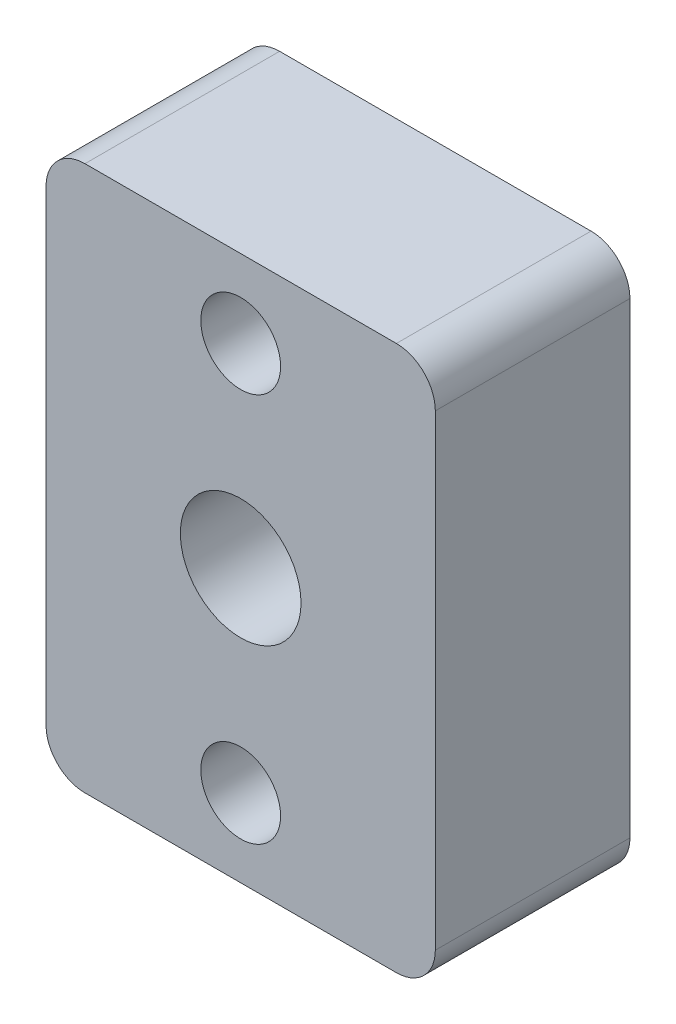
ISO-10303-21;
HEADER;
FILE_DESCRIPTION(('STEP AP214'),'2;1');
FILE_NAME('part.step','',(''),(''),'','','');
FILE_SCHEMA(('AUTOMOTIVE_DESIGN { 1 0 10303 214 1 1 1 1 }'));
ENDSEC;
DATA;
#1=APPLICATION_CONTEXT('core data for automotive mechanical design processes');
#2=APPLICATION_PROTOCOL_DEFINITION('international standard','automotive_design',2000,#1);
#3=PRODUCT_CONTEXT('',#1,'mechanical');
#4=PRODUCT('Part','Part','',(#3));
#5=PRODUCT_RELATED_PRODUCT_CATEGORY('part','',(#4));
#6=PRODUCT_DEFINITION_FORMATION('','',#4);
#7=PRODUCT_DEFINITION_CONTEXT('part definition',#1,'design');
#8=PRODUCT_DEFINITION('design','',#6,#7);
#9=PRODUCT_DEFINITION_SHAPE('','',#8);
#10=(LENGTH_UNIT() NAMED_UNIT(*) SI_UNIT(.MILLI.,.METRE.));
#11=(NAMED_UNIT(*) PLANE_ANGLE_UNIT() SI_UNIT($,.RADIAN.));
#12=(NAMED_UNIT(*) SI_UNIT($,.STERADIAN.) SOLID_ANGLE_UNIT());
#13=UNCERTAINTY_MEASURE_WITH_UNIT(LENGTH_MEASURE(1.E-05),#10,'distance_accuracy_value','');
#14=(GEOMETRIC_REPRESENTATION_CONTEXT(3) GLOBAL_UNCERTAINTY_ASSIGNED_CONTEXT((#13)) GLOBAL_UNIT_ASSIGNED_CONTEXT((#10,
#11,#12)) REPRESENTATION_CONTEXT('',''));
#15=CARTESIAN_POINT('',(0.,0.,0.));
#16=DIRECTION('',(0.,0.,1.));
#17=DIRECTION('',(1.,0.,0.));
#18=AXIS2_PLACEMENT_3D('',#15,#16,#17);
#19=CARTESIAN_POINT('',(0.,0.,5.));
#20=DIRECTION('',(0.,0.,-1.));
#21=DIRECTION('',(-1.,0.,0.));
#22=AXIS2_PLACEMENT_3D('',#19,#20,#21);
#23=PLANE('',#22);
#24=DIRECTION('',(1.,0.,0.));
#25=VECTOR('',#24,1.);
#26=CARTESIAN_POINT('',(-10.,-14.,5.));
#27=LINE('',#26,#25);
#28=CARTESIAN_POINT('',(-8.,-14.,5.));
#29=VERTEX_POINT('',#28);
#30=CARTESIAN_POINT('',(8.00000000000001,-14.,5.));
#31=VERTEX_POINT('',#30);
#32=EDGE_CURVE('E140',#29,#31,#27,.T.);
#33=ORIENTED_EDGE('',*,*,#32,.T.);
#34=CARTESIAN_POINT('',(8.,-12.,5.));
#35=DIRECTION('',(0.,0.,-1.));
#36=DIRECTION('',(-1.,0.,0.));
#37=AXIS2_PLACEMENT_3D('',#34,#35,#36);
#38=CIRCLE('',#37,2.);
#39=CARTESIAN_POINT('',(10.,-12.,5.));
#40=VERTEX_POINT('',#39);
#41=EDGE_CURVE('E159',#31,#40,#38,.F.);
#42=ORIENTED_EDGE('',*,*,#41,.T.);
#43=DIRECTION('',(0.,1.,0.));
#44=VECTOR('',#43,1.);
#45=CARTESIAN_POINT('',(10.,-14.,5.));
#46=LINE('',#45,#44);
#47=CARTESIAN_POINT('',(10.,12.,5.));
#48=VERTEX_POINT('',#47);
#49=EDGE_CURVE('E123',#40,#48,#46,.T.);
#50=ORIENTED_EDGE('',*,*,#49,.T.);
#51=CARTESIAN_POINT('',(8.00000000000001,12.,5.));
#52=DIRECTION('',(0.,0.,-1.));
#53=DIRECTION('',(-1.,0.,0.));
#54=AXIS2_PLACEMENT_3D('',#51,#52,#53);
#55=CIRCLE('',#54,2.);
#56=CARTESIAN_POINT('',(8.00000000000001,14.,5.));
#57=VERTEX_POINT('',#56);
#58=EDGE_CURVE('E154',#48,#57,#55,.F.);
#59=ORIENTED_EDGE('',*,*,#58,.T.);
#60=DIRECTION('',(-1.,0.,0.));
#61=VECTOR('',#60,1.);
#62=CARTESIAN_POINT('',(-10.,14.,5.));
#63=LINE('',#62,#61);
#64=CARTESIAN_POINT('',(-8.,14.,5.));
#65=VERTEX_POINT('',#64);
#66=EDGE_CURVE('E170',#57,#65,#63,.T.);
#67=ORIENTED_EDGE('',*,*,#66,.T.);
#68=CARTESIAN_POINT('',(-8.,12.,5.));
#69=DIRECTION('',(0.,0.,-1.));
#70=DIRECTION('',(-1.,0.,0.));
#71=AXIS2_PLACEMENT_3D('',#68,#69,#70);
#72=CIRCLE('',#71,2.);
#73=CARTESIAN_POINT('',(-10.,12.,5.));
#74=VERTEX_POINT('',#73);
#75=EDGE_CURVE('E59',#65,#74,#72,.F.);
#76=ORIENTED_EDGE('',*,*,#75,.T.);
#77=DIRECTION('',(0.,-1.,0.));
#78=VECTOR('',#77,1.);
#79=CARTESIAN_POINT('',(-10.,-14.,5.));
#80=LINE('',#79,#78);
#81=CARTESIAN_POINT('',(-10.,-12.,5.));
#82=VERTEX_POINT('',#81);
#83=EDGE_CURVE('E178',#74,#82,#80,.T.);
#84=ORIENTED_EDGE('',*,*,#83,.T.);
#85=CARTESIAN_POINT('',(-8.,-12.,5.));
#86=DIRECTION('',(0.,0.,-1.));
#87=DIRECTION('',(-1.,0.,0.));
#88=AXIS2_PLACEMENT_3D('',#85,#86,#87);
#89=CIRCLE('',#88,2.);
#90=EDGE_CURVE('E157',#82,#29,#89,.F.);
#91=ORIENTED_EDGE('',*,*,#90,.T.);
#92=EDGE_LOOP('',(#33,#42,#50,#59,#67,#76,#84,#91));
#93=FACE_BOUND('',#92,.T.);
#94=CARTESIAN_POINT('',(0.,10.,5.));
#95=DIRECTION('',(0.,0.,1.));
#96=DIRECTION('',(1.,0.,0.));
#97=AXIS2_PLACEMENT_3D('',#94,#95,#96);
#98=CIRCLE('',#97,2.05);
#99=CARTESIAN_POINT('',(2.05,10.,5.));
#100=VERTEX_POINT('',#99);
#101=EDGE_CURVE('E131',#100,#100,#98,.T.);
#102=ORIENTED_EDGE('',*,*,#101,.F.);
#103=EDGE_LOOP('',(#102));
#104=FACE_BOUND('',#103,.T.);
#105=CARTESIAN_POINT('',(0.,-10.,5.));
#106=DIRECTION('',(0.,0.,1.));
#107=DIRECTION('',(1.,0.,0.));
#108=AXIS2_PLACEMENT_3D('',#105,#106,#107);
#109=CIRCLE('',#108,2.05);
#110=CARTESIAN_POINT('',(2.05,-10.,5.));
#111=VERTEX_POINT('',#110);
#112=EDGE_CURVE('E185',#111,#111,#109,.T.);
#113=ORIENTED_EDGE('',*,*,#112,.F.);
#114=EDGE_LOOP('',(#113));
#115=FACE_BOUND('',#114,.T.);
#116=CARTESIAN_POINT('',(0.,0.,5.));
#117=DIRECTION('',(0.,0.,1.));
#118=DIRECTION('',(1.,0.,0.));
#119=AXIS2_PLACEMENT_3D('',#116,#117,#118);
#120=CIRCLE('',#119,3.1);
#121=CARTESIAN_POINT('',(3.1,0.,5.));
#122=VERTEX_POINT('',#121);
#123=EDGE_CURVE('E190',#122,#122,#120,.T.);
#124=ORIENTED_EDGE('',*,*,#123,.F.);
#125=EDGE_LOOP('',(#124));
#126=FACE_BOUND('',#125,.T.);
#127=ADVANCED_FACE('F37',(#93,#104,#115,#126),#23,.F.);
#128=CARTESIAN_POINT('',(0.,0.,-5.));
#129=DIRECTION('',(0.,0.,-1.));
#130=DIRECTION('',(-1.,0.,0.));
#131=AXIS2_PLACEMENT_3D('',#128,#129,#130);
#132=PLANE('',#131);
#133=CARTESIAN_POINT('',(0.,-10.,-5.));
#134=DIRECTION('',(0.,0.,1.));
#135=DIRECTION('',(1.,0.,0.));
#136=AXIS2_PLACEMENT_3D('',#133,#134,#135);
#137=CIRCLE('',#136,2.05);
#138=CARTESIAN_POINT('',(2.05,-10.,-5.));
#139=VERTEX_POINT('',#138);
#140=EDGE_CURVE('E187',#139,#139,#137,.T.);
#141=ORIENTED_EDGE('',*,*,#140,.T.);
#142=EDGE_LOOP('',(#141));
#143=FACE_BOUND('',#142,.T.);
#144=DIRECTION('',(0.,1.,0.));
#145=VECTOR('',#144,1.);
#146=CARTESIAN_POINT('',(10.,-14.,-5.));
#147=LINE('',#146,#145);
#148=CARTESIAN_POINT('',(10.,-12.,-5.));
#149=VERTEX_POINT('',#148);
#150=CARTESIAN_POINT('',(10.,12.,-5.));
#151=VERTEX_POINT('',#150);
#152=EDGE_CURVE('E120',#149,#151,#147,.T.);
#153=ORIENTED_EDGE('',*,*,#152,.F.);
#154=CARTESIAN_POINT('',(8.,-12.,-5.));
#155=DIRECTION('',(0.,0.,-1.));
#156=DIRECTION('',(-1.,0.,0.));
#157=AXIS2_PLACEMENT_3D('',#154,#155,#156);
#158=CIRCLE('',#157,2.);
#159=CARTESIAN_POINT('',(8.00000000000001,-14.,-5.));
#160=VERTEX_POINT('',#159);
#161=EDGE_CURVE('E103',#149,#160,#158,.T.);
#162=ORIENTED_EDGE('',*,*,#161,.T.);
#163=DIRECTION('',(1.,0.,0.));
#164=VECTOR('',#163,1.);
#165=CARTESIAN_POINT('',(-10.,-14.,-5.));
#166=LINE('',#165,#164);
#167=CARTESIAN_POINT('',(-8.,-14.,-5.));
#168=VERTEX_POINT('',#167);
#169=EDGE_CURVE('E144',#168,#160,#166,.T.);
#170=ORIENTED_EDGE('',*,*,#169,.F.);
#171=CARTESIAN_POINT('',(-8.,-12.,-5.));
#172=DIRECTION('',(0.,0.,-1.));
#173=DIRECTION('',(-1.,0.,0.));
#174=AXIS2_PLACEMENT_3D('',#171,#172,#173);
#175=CIRCLE('',#174,2.);
#176=CARTESIAN_POINT('',(-10.,-12.,-5.));
#177=VERTEX_POINT('',#176);
#178=EDGE_CURVE('E114',#168,#177,#175,.T.);
#179=ORIENTED_EDGE('',*,*,#178,.T.);
#180=DIRECTION('',(0.,-1.,0.));
#181=VECTOR('',#180,1.);
#182=CARTESIAN_POINT('',(-10.,-14.,-5.));
#183=LINE('',#182,#181);
#184=CARTESIAN_POINT('',(-10.,12.,-5.));
#185=VERTEX_POINT('',#184);
#186=EDGE_CURVE('E134',#185,#177,#183,.T.);
#187=ORIENTED_EDGE('',*,*,#186,.F.);
#188=CARTESIAN_POINT('',(-8.,12.,-5.));
#189=DIRECTION('',(0.,0.,-1.));
#190=DIRECTION('',(-1.,0.,0.));
#191=AXIS2_PLACEMENT_3D('',#188,#189,#190);
#192=CIRCLE('',#191,2.);
#193=CARTESIAN_POINT('',(-8.,14.,-5.));
#194=VERTEX_POINT('',#193);
#195=EDGE_CURVE('E148',#185,#194,#192,.T.);
#196=ORIENTED_EDGE('',*,*,#195,.T.);
#197=DIRECTION('',(-1.,0.,0.));
#198=VECTOR('',#197,1.);
#199=CARTESIAN_POINT('',(-10.,14.,-5.));
#200=LINE('',#199,#198);
#201=CARTESIAN_POINT('',(8.00000000000001,14.,-5.));
#202=VERTEX_POINT('',#201);
#203=EDGE_CURVE('E130',#202,#194,#200,.T.);
#204=ORIENTED_EDGE('',*,*,#203,.F.);
#205=CARTESIAN_POINT('',(8.00000000000001,12.,-5.));
#206=DIRECTION('',(0.,0.,-1.));
#207=DIRECTION('',(-1.,0.,0.));
#208=AXIS2_PLACEMENT_3D('',#205,#206,#207);
#209=CIRCLE('',#208,2.);
#210=EDGE_CURVE('E124',#202,#151,#209,.T.);
#211=ORIENTED_EDGE('',*,*,#210,.T.);
#212=EDGE_LOOP('',(#153,#162,#170,#179,#187,#196,#204,#211));
#213=FACE_BOUND('',#212,.T.);
#214=CARTESIAN_POINT('',(0.,10.,-5.));
#215=DIRECTION('',(0.,0.,1.));
#216=DIRECTION('',(1.,0.,0.));
#217=AXIS2_PLACEMENT_3D('',#214,#215,#216);
#218=CIRCLE('',#217,2.05);
#219=CARTESIAN_POINT('',(2.05,10.,-5.));
#220=VERTEX_POINT('',#219);
#221=EDGE_CURVE('E137',#220,#220,#218,.T.);
#222=ORIENTED_EDGE('',*,*,#221,.T.);
#223=EDGE_LOOP('',(#222));
#224=FACE_BOUND('',#223,.T.);
#225=CARTESIAN_POINT('',(0.,0.,-5.));
#226=DIRECTION('',(0.,0.,1.));
#227=DIRECTION('',(1.,0.,0.));
#228=AXIS2_PLACEMENT_3D('',#225,#226,#227);
#229=CIRCLE('',#228,3.1);
#230=CARTESIAN_POINT('',(3.1,0.,-5.));
#231=VERTEX_POINT('',#230);
#232=EDGE_CURVE('E193',#231,#231,#229,.T.);
#233=ORIENTED_EDGE('',*,*,#232,.T.);
#234=EDGE_LOOP('',(#233));
#235=FACE_BOUND('',#234,.T.);
#236=ADVANCED_FACE('F127',(#143,#213,#224,#235),#132,.T.);
#237=CARTESIAN_POINT('',(10.,-14.,5.));
#238=DIRECTION('',(-1.,0.,0.));
#239=DIRECTION('',(0.,0.,1.));
#240=AXIS2_PLACEMENT_3D('',#237,#238,#239);
#241=PLANE('',#240);
#242=ORIENTED_EDGE('',*,*,#49,.F.);
#243=DIRECTION('',(0.,0.,-1.));
#244=VECTOR('',#243,1.);
#245=CARTESIAN_POINT('',(10.,-12.,5.));
#246=LINE('',#245,#244);
#247=EDGE_CURVE('E107',#40,#149,#246,.T.);
#248=ORIENTED_EDGE('',*,*,#247,.T.);
#249=ORIENTED_EDGE('',*,*,#152,.T.);
#250=DIRECTION('',(0.,0.,-1.));
#251=VECTOR('',#250,1.);
#252=CARTESIAN_POINT('',(10.,12.,5.));
#253=LINE('',#252,#251);
#254=EDGE_CURVE('E125',#151,#48,#253,.F.);
#255=ORIENTED_EDGE('',*,*,#254,.T.);
#256=EDGE_LOOP('',(#242,#248,#249,#255));
#257=FACE_BOUND('',#256,.T.);
#258=ADVANCED_FACE('F119',(#257),#241,.F.);
#259=CARTESIAN_POINT('',(-10.,14.,5.));
#260=DIRECTION('',(0.,-1.,0.));
#261=DIRECTION('',(0.,0.,-1.));
#262=AXIS2_PLACEMENT_3D('',#259,#260,#261);
#263=PLANE('',#262);
#264=ORIENTED_EDGE('',*,*,#203,.T.);
#265=DIRECTION('',(0.,0.,-1.));
#266=VECTOR('',#265,1.);
#267=CARTESIAN_POINT('',(-8.,14.,5.));
#268=LINE('',#267,#266);
#269=EDGE_CURVE('E11',#194,#65,#268,.F.);
#270=ORIENTED_EDGE('',*,*,#269,.T.);
#271=ORIENTED_EDGE('',*,*,#66,.F.);
#272=DIRECTION('',(0.,0.,-1.));
#273=VECTOR('',#272,1.);
#274=CARTESIAN_POINT('',(8.00000000000001,14.,5.));
#275=LINE('',#274,#273);
#276=EDGE_CURVE('E45',#57,#202,#275,.T.);
#277=ORIENTED_EDGE('',*,*,#276,.T.);
#278=EDGE_LOOP('',(#264,#270,#271,#277));
#279=FACE_BOUND('',#278,.T.);
#280=ADVANCED_FACE('F168',(#279),#263,.F.);
#281=CARTESIAN_POINT('',(-10.,-14.,5.));
#282=DIRECTION('',(1.,0.,0.));
#283=DIRECTION('',(0.,0.,-1.));
#284=AXIS2_PLACEMENT_3D('',#281,#282,#283);
#285=PLANE('',#284);
#286=ORIENTED_EDGE('',*,*,#186,.T.);
#287=DIRECTION('',(0.,0.,-1.));
#288=VECTOR('',#287,1.);
#289=CARTESIAN_POINT('',(-10.,-12.,5.));
#290=LINE('',#289,#288);
#291=EDGE_CURVE('E52',#177,#82,#290,.F.);
#292=ORIENTED_EDGE('',*,*,#291,.T.);
#293=ORIENTED_EDGE('',*,*,#83,.F.);
#294=DIRECTION('',(0.,0.,-1.));
#295=VECTOR('',#294,1.);
#296=CARTESIAN_POINT('',(-10.,12.,5.));
#297=LINE('',#296,#295);
#298=EDGE_CURVE('E161',#74,#185,#297,.T.);
#299=ORIENTED_EDGE('',*,*,#298,.T.);
#300=EDGE_LOOP('',(#286,#292,#293,#299));
#301=FACE_BOUND('',#300,.T.);
#302=ADVANCED_FACE('F177',(#301),#285,.F.);
#303=CARTESIAN_POINT('',(-10.,-14.,5.));
#304=DIRECTION('',(0.,1.,0.));
#305=DIRECTION('',(0.,0.,1.));
#306=AXIS2_PLACEMENT_3D('',#303,#304,#305);
#307=PLANE('',#306);
#308=ORIENTED_EDGE('',*,*,#169,.T.);
#309=DIRECTION('',(0.,0.,-1.));
#310=VECTOR('',#309,1.);
#311=CARTESIAN_POINT('',(8.00000000000001,-14.,5.));
#312=LINE('',#311,#310);
#313=EDGE_CURVE('E108',#160,#31,#312,.F.);
#314=ORIENTED_EDGE('',*,*,#313,.T.);
#315=ORIENTED_EDGE('',*,*,#32,.F.);
#316=DIRECTION('',(0.,0.,-1.));
#317=VECTOR('',#316,1.);
#318=CARTESIAN_POINT('',(-8.,-14.,5.));
#319=LINE('',#318,#317);
#320=EDGE_CURVE('E113',#29,#168,#319,.T.);
#321=ORIENTED_EDGE('',*,*,#320,.T.);
#322=EDGE_LOOP('',(#308,#314,#315,#321));
#323=FACE_BOUND('',#322,.T.);
#324=ADVANCED_FACE('F214',(#323),#307,.F.);
#325=CARTESIAN_POINT('',(0.,10.,5.));
#326=DIRECTION('',(0.,0.,-1.));
#327=DIRECTION('',(-1.,0.,0.));
#328=AXIS2_PLACEMENT_3D('',#325,#326,#327);
#329=CYLINDRICAL_SURFACE('',#328,2.05);
#330=ORIENTED_EDGE('',*,*,#101,.T.);
#331=EDGE_LOOP('',(#330));
#332=FACE_BOUND('',#331,.T.);
#333=ORIENTED_EDGE('',*,*,#221,.F.);
#334=EDGE_LOOP('',(#333));
#335=FACE_BOUND('',#334,.T.);
#336=ADVANCED_FACE('F211',(#332,#335),#329,.F.);
#337=CARTESIAN_POINT('',(0.,-10.,5.));
#338=DIRECTION('',(0.,0.,-1.));
#339=DIRECTION('',(-1.,0.,0.));
#340=AXIS2_PLACEMENT_3D('',#337,#338,#339);
#341=CYLINDRICAL_SURFACE('',#340,2.05);
#342=ORIENTED_EDGE('',*,*,#112,.T.);
#343=EDGE_LOOP('',(#342));
#344=FACE_BOUND('',#343,.T.);
#345=ORIENTED_EDGE('',*,*,#140,.F.);
#346=EDGE_LOOP('',(#345));
#347=FACE_BOUND('',#346,.T.);
#348=ADVANCED_FACE('F298',(#344,#347),#341,.F.);
#349=CARTESIAN_POINT('',(0.,0.,5.));
#350=DIRECTION('',(0.,0.,-1.));
#351=DIRECTION('',(-1.,0.,0.));
#352=AXIS2_PLACEMENT_3D('',#349,#350,#351);
#353=CYLINDRICAL_SURFACE('',#352,3.1);
#354=ORIENTED_EDGE('',*,*,#123,.T.);
#355=EDGE_LOOP('',(#354));
#356=FACE_BOUND('',#355,.T.);
#357=ORIENTED_EDGE('',*,*,#232,.F.);
#358=EDGE_LOOP('',(#357));
#359=FACE_BOUND('',#358,.T.);
#360=ADVANCED_FACE('F199',(#356,#359),#353,.F.);
#361=CARTESIAN_POINT('',(8.,-12.,5.));
#362=DIRECTION('',(0.,0.,-1.));
#363=DIRECTION('',(-1.,0.,0.));
#364=AXIS2_PLACEMENT_3D('',#361,#362,#363);
#365=CYLINDRICAL_SURFACE('',#364,2.);
#366=ORIENTED_EDGE('',*,*,#41,.F.);
#367=ORIENTED_EDGE('',*,*,#313,.F.);
#368=ORIENTED_EDGE('',*,*,#161,.F.);
#369=ORIENTED_EDGE('',*,*,#247,.F.);
#370=EDGE_LOOP('',(#366,#367,#368,#369));
#371=FACE_BOUND('',#370,.T.);
#372=ADVANCED_FACE('F106',(#371),#365,.T.);
#373=CARTESIAN_POINT('',(-8.,-12.,5.));
#374=DIRECTION('',(0.,0.,-1.));
#375=DIRECTION('',(-1.,0.,0.));
#376=AXIS2_PLACEMENT_3D('',#373,#374,#375);
#377=CYLINDRICAL_SURFACE('',#376,2.);
#378=ORIENTED_EDGE('',*,*,#90,.F.);
#379=ORIENTED_EDGE('',*,*,#291,.F.);
#380=ORIENTED_EDGE('',*,*,#178,.F.);
#381=ORIENTED_EDGE('',*,*,#320,.F.);
#382=EDGE_LOOP('',(#378,#379,#380,#381));
#383=FACE_BOUND('',#382,.T.);
#384=ADVANCED_FACE('F226',(#383),#377,.T.);
#385=CARTESIAN_POINT('',(-8.,12.,5.));
#386=DIRECTION('',(0.,0.,-1.));
#387=DIRECTION('',(-1.,0.,0.));
#388=AXIS2_PLACEMENT_3D('',#385,#386,#387);
#389=CYLINDRICAL_SURFACE('',#388,2.);
#390=ORIENTED_EDGE('',*,*,#75,.F.);
#391=ORIENTED_EDGE('',*,*,#269,.F.);
#392=ORIENTED_EDGE('',*,*,#195,.F.);
#393=ORIENTED_EDGE('',*,*,#298,.F.);
#394=EDGE_LOOP('',(#390,#391,#392,#393));
#395=FACE_BOUND('',#394,.T.);
#396=ADVANCED_FACE('F176',(#395),#389,.T.);
#397=CARTESIAN_POINT('',(8.00000000000001,12.,5.));
#398=DIRECTION('',(0.,0.,-1.));
#399=DIRECTION('',(-1.,0.,0.));
#400=AXIS2_PLACEMENT_3D('',#397,#398,#399);
#401=CYLINDRICAL_SURFACE('',#400,2.);
#402=ORIENTED_EDGE('',*,*,#58,.F.);
#403=ORIENTED_EDGE('',*,*,#254,.F.);
#404=ORIENTED_EDGE('',*,*,#210,.F.);
#405=ORIENTED_EDGE('',*,*,#276,.F.);
#406=EDGE_LOOP('',(#402,#403,#404,#405));
#407=FACE_BOUND('',#406,.T.);
#408=ADVANCED_FACE('F39',(#407),#401,.T.);
#409=CLOSED_SHELL('',(#127,#236,#258,#280,#302,#324,#336,#348,#360,#372,#384,#396,#408));
#410=MANIFOLD_SOLID_BREP('B2',#409);
#411=ADVANCED_BREP_SHAPE_REPRESENTATION('',(#18,#410),#14);
#412=SHAPE_DEFINITION_REPRESENTATION(#9,#411);
ENDSEC;
END-ISO-10303-21;
